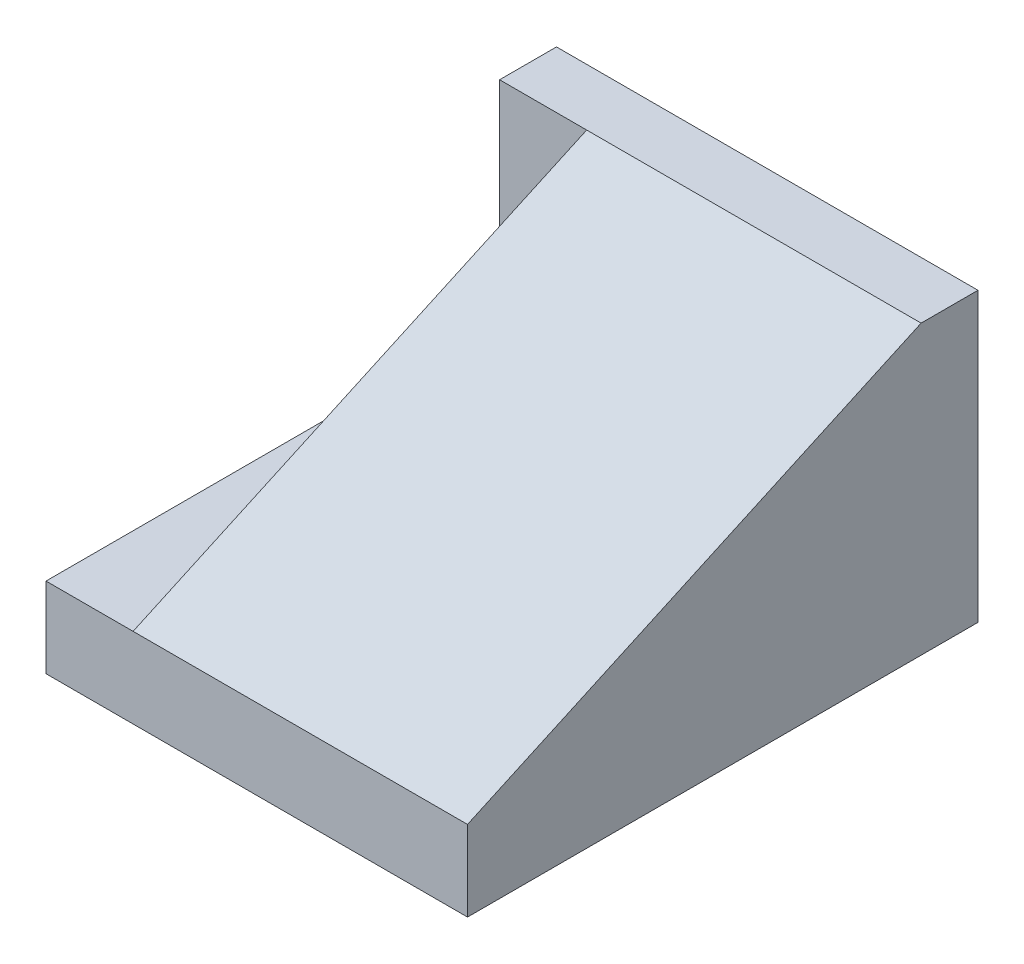
ISO-10303-21;
HEADER;
FILE_DESCRIPTION(('STEP AP214'),'2;1');
FILE_NAME('part.step','',(''),(''),'','','');
FILE_SCHEMA(('AUTOMOTIVE_DESIGN { 1 0 10303 214 1 1 1 1 }'));
ENDSEC;
DATA;
#1=APPLICATION_CONTEXT('core data for automotive mechanical design processes');
#2=APPLICATION_PROTOCOL_DEFINITION('international standard','automotive_design',2000,#1);
#3=PRODUCT_CONTEXT('',#1,'mechanical');
#4=PRODUCT('Part','Part','',(#3));
#5=PRODUCT_RELATED_PRODUCT_CATEGORY('part','',(#4));
#6=PRODUCT_DEFINITION_FORMATION('','',#4);
#7=PRODUCT_DEFINITION_CONTEXT('part definition',#1,'design');
#8=PRODUCT_DEFINITION('design','',#6,#7);
#9=PRODUCT_DEFINITION_SHAPE('','',#8);
#10=(LENGTH_UNIT() NAMED_UNIT(*) SI_UNIT(.MILLI.,.METRE.));
#11=(NAMED_UNIT(*) PLANE_ANGLE_UNIT() SI_UNIT($,.RADIAN.));
#12=(NAMED_UNIT(*) SI_UNIT($,.STERADIAN.) SOLID_ANGLE_UNIT());
#13=UNCERTAINTY_MEASURE_WITH_UNIT(LENGTH_MEASURE(1.E-05),#10,'distance_accuracy_value','');
#14=(GEOMETRIC_REPRESENTATION_CONTEXT(3) GLOBAL_UNCERTAINTY_ASSIGNED_CONTEXT((#13)) GLOBAL_UNIT_ASSIGNED_CONTEXT((#10,
#11,#12)) REPRESENTATION_CONTEXT('',''));
#15=CARTESIAN_POINT('',(0.,0.,0.));
#16=DIRECTION('',(0.,0.,1.));
#17=DIRECTION('',(1.,0.,0.));
#18=AXIS2_PLACEMENT_3D('',#15,#16,#17);
#19=CARTESIAN_POINT('',(0.,24.,0.));
#20=DIRECTION('',(0.,1.,0.));
#21=DIRECTION('',(0.,0.,1.));
#22=AXIS2_PLACEMENT_3D('',#19,#20,#21);
#23=PLANE('',#22);
#24=DIRECTION('',(1.,0.,0.));
#25=VECTOR('',#24,1.);
#26=CARTESIAN_POINT('',(-63.0210755779667,24.,76.3209778914986));
#27=LINE('',#26,#25);
#28=CARTESIAN_POINT('',(-63.0210755779667,24.,76.3209778914986));
#29=VERTEX_POINT('',#28);
#30=CARTESIAN_POINT('',(-36.9789244220333,24.,76.3209778914986));
#31=VERTEX_POINT('',#30);
#32=EDGE_CURVE('E88',#29,#31,#27,.T.);
#33=ORIENTED_EDGE('',*,*,#32,.T.);
#34=DIRECTION('',(0.,0.,-1.));
#35=VECTOR('',#34,1.);
#36=CARTESIAN_POINT('',(-36.9789244220333,24.,0.));
#37=LINE('',#36,#35);
#38=CARTESIAN_POINT('',(-36.9789244220333,24.,-59.3116807177635));
#39=VERTEX_POINT('',#38);
#40=EDGE_CURVE('E216',#31,#39,#37,.T.);
#41=ORIENTED_EDGE('',*,*,#40,.T.);
#42=DIRECTION('',(1.,0.,0.));
#43=VECTOR('',#42,1.);
#44=CARTESIAN_POINT('',(-63.0210755779667,24.,-59.3116807177635));
#45=LINE('',#44,#43);
#46=CARTESIAN_POINT('',(-63.0210755779667,24.,-59.3116807177635));
#47=VERTEX_POINT('',#46);
#48=EDGE_CURVE('E48',#47,#39,#45,.T.);
#49=ORIENTED_EDGE('',*,*,#48,.F.);
#50=DIRECTION('',(0.,0.,1.));
#51=VECTOR('',#50,1.);
#52=CARTESIAN_POINT('',(-63.0210755779667,24.,-76.3209778914986));
#53=LINE('',#52,#51);
#54=EDGE_CURVE('E53',#47,#29,#53,.T.);
#55=ORIENTED_EDGE('',*,*,#54,.T.);
#56=EDGE_LOOP('',(#33,#41,#49,#55));
#57=FACE_BOUND('',#56,.T.);
#58=ADVANCED_FACE('F33',(#57),#23,.T.);
#59=CARTESIAN_POINT('',(-63.0210755779667,86.,-59.3116807177635));
#60=DIRECTION('',(0.,0.,-1.));
#61=DIRECTION('',(-1.,0.,0.));
#62=AXIS2_PLACEMENT_3D('',#59,#60,#61);
#63=PLANE('',#62);
#64=DIRECTION('',(0.,-1.,0.));
#65=VECTOR('',#64,1.);
#66=CARTESIAN_POINT('',(-36.9789244220333,86.,-59.3116807177635));
#67=LINE('',#66,#65);
#68=CARTESIAN_POINT('',(-36.9789244220333,86.,-59.3116807177635));
#69=VERTEX_POINT('',#68);
#70=EDGE_CURVE('E222',#69,#39,#67,.T.);
#71=ORIENTED_EDGE('',*,*,#70,.F.);
#72=DIRECTION('',(1.,0.,0.));
#73=VECTOR('',#72,1.);
#74=CARTESIAN_POINT('',(-63.0210755779667,86.,-59.3116807177635));
#75=LINE('',#74,#73);
#76=CARTESIAN_POINT('',(-63.0210755779667,86.,-59.3116807177635));
#77=VERTEX_POINT('',#76);
#78=EDGE_CURVE('E241',#77,#69,#75,.T.);
#79=ORIENTED_EDGE('',*,*,#78,.F.);
#80=DIRECTION('',(0.,-1.,0.));
#81=VECTOR('',#80,1.);
#82=CARTESIAN_POINT('',(-63.0210755779667,86.,-59.3116807177635));
#83=LINE('',#82,#81);
#84=EDGE_CURVE('E105',#77,#47,#83,.T.);
#85=ORIENTED_EDGE('',*,*,#84,.T.);
#86=ORIENTED_EDGE('',*,*,#48,.T.);
#87=EDGE_LOOP('',(#71,#79,#85,#86));
#88=FACE_BOUND('',#87,.T.);
#89=ADVANCED_FACE('F116',(#88),#63,.F.);
#90=CARTESIAN_POINT('',(63.0210755779667,24.,-76.3209778914986));
#91=DIRECTION('',(-1.,0.,0.));
#92=DIRECTION('',(0.,0.,1.));
#93=AXIS2_PLACEMENT_3D('',#90,#91,#92);
#94=PLANE('',#93);
#95=DIRECTION('',(0.,0.,-1.));
#96=VECTOR('',#95,1.);
#97=CARTESIAN_POINT('',(63.0210755779667,0.,-76.3209778914986));
#98=LINE('',#97,#96);
#99=CARTESIAN_POINT('',(63.0210755779667,0.,76.3209778914986));
#100=VERTEX_POINT('',#99);
#101=CARTESIAN_POINT('',(63.0210755779667,0.,-76.3209778914986));
#102=VERTEX_POINT('',#101);
#103=EDGE_CURVE('E94',#100,#102,#98,.T.);
#104=ORIENTED_EDGE('',*,*,#103,.T.);
#105=DIRECTION('',(0.,-1.,0.));
#106=VECTOR('',#105,1.);
#107=CARTESIAN_POINT('',(63.0210755779667,24.,-76.3209778914986));
#108=LINE('',#107,#106);
#109=CARTESIAN_POINT('',(63.0210755779667,86.,-76.3209778914986));
#110=VERTEX_POINT('',#109);
#111=EDGE_CURVE('E11',#110,#102,#108,.T.);
#112=ORIENTED_EDGE('',*,*,#111,.F.);
#113=DIRECTION('',(0.,0.,-1.));
#114=VECTOR('',#113,1.);
#115=CARTESIAN_POINT('',(63.0210755779667,86.,-76.3209778914986));
#116=LINE('',#115,#114);
#117=CARTESIAN_POINT('',(63.0210755779667,86.,-59.3116807177635));
#118=VERTEX_POINT('',#117);
#119=EDGE_CURVE('E244',#118,#110,#116,.T.);
#120=ORIENTED_EDGE('',*,*,#119,.F.);
#121=DIRECTION('',(0.,-0.415740341776717,0.909483352359667));
#122=VECTOR('',#121,1.);
#123=CARTESIAN_POINT('',(63.0210755779667,86.,-59.3116807177635));
#124=LINE('',#123,#122);
#125=CARTESIAN_POINT('',(63.0210755779667,24.,76.3209778914986));
#126=VERTEX_POINT('',#125);
#127=EDGE_CURVE('E232',#118,#126,#124,.T.);
#128=ORIENTED_EDGE('',*,*,#127,.T.);
#129=DIRECTION('',(0.,-1.,0.));
#130=VECTOR('',#129,1.);
#131=CARTESIAN_POINT('',(63.0210755779667,24.,76.3209778914986));
#132=LINE('',#131,#130);
#133=EDGE_CURVE('E89',#126,#100,#132,.T.);
#134=ORIENTED_EDGE('',*,*,#133,.T.);
#135=EDGE_LOOP('',(#104,#112,#120,#128,#134));
#136=FACE_BOUND('',#135,.T.);
#137=ADVANCED_FACE('F35',(#136),#94,.F.);
#138=CARTESIAN_POINT('',(-63.0210755779667,24.,-76.3209778914986));
#139=DIRECTION('',(0.,0.,1.));
#140=DIRECTION('',(1.,0.,0.));
#141=AXIS2_PLACEMENT_3D('',#138,#139,#140);
#142=PLANE('',#141);
#143=DIRECTION('',(-1.,0.,0.));
#144=VECTOR('',#143,1.);
#145=CARTESIAN_POINT('',(-63.0210755779667,0.,-76.3209778914986));
#146=LINE('',#145,#144);
#147=CARTESIAN_POINT('',(-63.0210755779667,0.,-76.3209778914986));
#148=VERTEX_POINT('',#147);
#149=EDGE_CURVE('E81',#102,#148,#146,.T.);
#150=ORIENTED_EDGE('',*,*,#149,.T.);
#151=DIRECTION('',(0.,-1.,0.));
#152=VECTOR('',#151,1.);
#153=CARTESIAN_POINT('',(-63.0210755779667,24.,-76.3209778914986));
#154=LINE('',#153,#152);
#155=CARTESIAN_POINT('',(-63.0210755779667,86.,-76.3209778914986));
#156=VERTEX_POINT('',#155);
#157=EDGE_CURVE('E41',#156,#148,#154,.T.);
#158=ORIENTED_EDGE('',*,*,#157,.F.);
#159=DIRECTION('',(-1.,0.,0.));
#160=VECTOR('',#159,1.);
#161=CARTESIAN_POINT('',(-63.0210755779667,86.,-76.3209778914986));
#162=LINE('',#161,#160);
#163=EDGE_CURVE('E112',#110,#156,#162,.T.);
#164=ORIENTED_EDGE('',*,*,#163,.F.);
#165=ORIENTED_EDGE('',*,*,#111,.T.);
#166=EDGE_LOOP('',(#150,#158,#164,#165));
#167=FACE_BOUND('',#166,.T.);
#168=ADVANCED_FACE('F107',(#167),#142,.F.);
#169=CARTESIAN_POINT('',(-63.0210755779667,24.,-76.3209778914986));
#170=DIRECTION('',(1.,0.,0.));
#171=DIRECTION('',(0.,0.,-1.));
#172=AXIS2_PLACEMENT_3D('',#169,#170,#171);
#173=PLANE('',#172);
#174=DIRECTION('',(0.,0.,1.));
#175=VECTOR('',#174,1.);
#176=CARTESIAN_POINT('',(-63.0210755779667,0.,-76.3209778914986));
#177=LINE('',#176,#175);
#178=CARTESIAN_POINT('',(-63.0210755779667,0.,76.3209778914986));
#179=VERTEX_POINT('',#178);
#180=EDGE_CURVE('E71',#148,#179,#177,.T.);
#181=ORIENTED_EDGE('',*,*,#180,.T.);
#182=DIRECTION('',(0.,-1.,0.));
#183=VECTOR('',#182,1.);
#184=CARTESIAN_POINT('',(-63.0210755779667,24.,76.3209778914986));
#185=LINE('',#184,#183);
#186=EDGE_CURVE('E74',#29,#179,#185,.T.);
#187=ORIENTED_EDGE('',*,*,#186,.F.);
#188=ORIENTED_EDGE('',*,*,#54,.F.);
#189=ORIENTED_EDGE('',*,*,#84,.F.);
#190=DIRECTION('',(0.,0.,1.));
#191=VECTOR('',#190,1.);
#192=CARTESIAN_POINT('',(-63.0210755779667,86.,-76.3209778914986));
#193=LINE('',#192,#191);
#194=EDGE_CURVE('E235',#156,#77,#193,.T.);
#195=ORIENTED_EDGE('',*,*,#194,.F.);
#196=ORIENTED_EDGE('',*,*,#157,.T.);
#197=EDGE_LOOP('',(#181,#187,#188,#189,#195,#196));
#198=FACE_BOUND('',#197,.T.);
#199=ADVANCED_FACE('F73',(#198),#173,.F.);
#200=CARTESIAN_POINT('',(-63.0210755779667,24.,76.3209778914986));
#201=DIRECTION('',(0.,0.,-1.));
#202=DIRECTION('',(-1.,0.,0.));
#203=AXIS2_PLACEMENT_3D('',#200,#201,#202);
#204=PLANE('',#203);
#205=DIRECTION('',(1.,0.,0.));
#206=VECTOR('',#205,1.);
#207=CARTESIAN_POINT('',(0.,24.,76.3209778914987));
#208=LINE('',#207,#206);
#209=EDGE_CURVE('E224',#31,#126,#208,.T.);
#210=ORIENTED_EDGE('',*,*,#209,.F.);
#211=ORIENTED_EDGE('',*,*,#32,.F.);
#212=ORIENTED_EDGE('',*,*,#186,.T.);
#213=DIRECTION('',(1.,0.,0.));
#214=VECTOR('',#213,1.);
#215=CARTESIAN_POINT('',(-63.0210755779667,0.,76.3209778914986));
#216=LINE('',#215,#214);
#217=EDGE_CURVE('E80',#179,#100,#216,.T.);
#218=ORIENTED_EDGE('',*,*,#217,.T.);
#219=ORIENTED_EDGE('',*,*,#133,.F.);
#220=EDGE_LOOP('',(#210,#211,#212,#218,#219));
#221=FACE_BOUND('',#220,.T.);
#222=ADVANCED_FACE('F85',(#221),#204,.F.);
#223=CARTESIAN_POINT('',(0.,0.,0.));
#224=DIRECTION('',(0.,1.,0.));
#225=DIRECTION('',(0.,0.,1.));
#226=AXIS2_PLACEMENT_3D('',#223,#224,#225);
#227=PLANE('',#226);
#228=ORIENTED_EDGE('',*,*,#103,.F.);
#229=ORIENTED_EDGE('',*,*,#217,.F.);
#230=ORIENTED_EDGE('',*,*,#180,.F.);
#231=ORIENTED_EDGE('',*,*,#149,.F.);
#232=EDGE_LOOP('',(#228,#229,#230,#231));
#233=FACE_BOUND('',#232,.T.);
#234=ADVANCED_FACE('F92',(#233),#227,.F.);
#235=CARTESIAN_POINT('',(0.,86.,0.));
#236=DIRECTION('',(0.,1.,0.));
#237=DIRECTION('',(0.,0.,1.));
#238=AXIS2_PLACEMENT_3D('',#235,#236,#237);
#239=PLANE('',#238);
#240=ORIENTED_EDGE('',*,*,#163,.T.);
#241=ORIENTED_EDGE('',*,*,#194,.T.);
#242=ORIENTED_EDGE('',*,*,#78,.T.);
#243=EDGE_CURVE('E231',#69,#118,#75,.T.);
#244=ORIENTED_EDGE('',*,*,#243,.T.);
#245=ORIENTED_EDGE('',*,*,#119,.T.);
#246=EDGE_LOOP('',(#240,#241,#242,#244,#245));
#247=FACE_BOUND('',#246,.T.);
#248=ADVANCED_FACE('F131',(#247),#239,.T.);
#249=CARTESIAN_POINT('',(63.0210755779667,86.,-59.3116807177635));
#250=DIRECTION('',(0.,0.909483352359667,0.415740341776717));
#251=DIRECTION('',(0.,-0.415740341776717,0.909483352359667));
#252=AXIS2_PLACEMENT_3D('',#249,#250,#251);
#253=PLANE('',#252);
#254=DIRECTION('',(0.,-0.415740341776717,0.909483352359667));
#255=VECTOR('',#254,1.);
#256=CARTESIAN_POINT('',(-36.9789244220333,86.,-59.3116807177635));
#257=LINE('',#256,#255);
#258=EDGE_CURVE('E219',#69,#31,#257,.T.);
#259=ORIENTED_EDGE('',*,*,#258,.T.);
#260=ORIENTED_EDGE('',*,*,#209,.T.);
#261=ORIENTED_EDGE('',*,*,#127,.F.);
#262=ORIENTED_EDGE('',*,*,#243,.F.);
#263=EDGE_LOOP('',(#259,#260,#261,#262));
#264=FACE_BOUND('',#263,.T.);
#265=ADVANCED_FACE('F153',(#264),#253,.T.);
#266=CARTESIAN_POINT('',(-36.9789244220333,43.,0.));
#267=DIRECTION('',(1.,0.,0.));
#268=DIRECTION('',(0.,0.,-1.));
#269=AXIS2_PLACEMENT_3D('',#266,#267,#268);
#270=PLANE('',#269);
#271=ORIENTED_EDGE('',*,*,#40,.F.);
#272=ORIENTED_EDGE('',*,*,#258,.F.);
#273=ORIENTED_EDGE('',*,*,#70,.T.);
#274=EDGE_LOOP('',(#271,#272,#273));
#275=FACE_BOUND('',#274,.T.);
#276=ADVANCED_FACE('F160',(#275),#270,.F.);
#277=CLOSED_SHELL('',(#58,#89,#137,#168,#199,#222,#234,#248,#265,#276));
#278=MANIFOLD_SOLID_BREP('B2',#277);
#279=ADVANCED_BREP_SHAPE_REPRESENTATION('',(#18,#278),#14);
#280=SHAPE_DEFINITION_REPRESENTATION(#9,#279);
ENDSEC;
END-ISO-10303-21;
